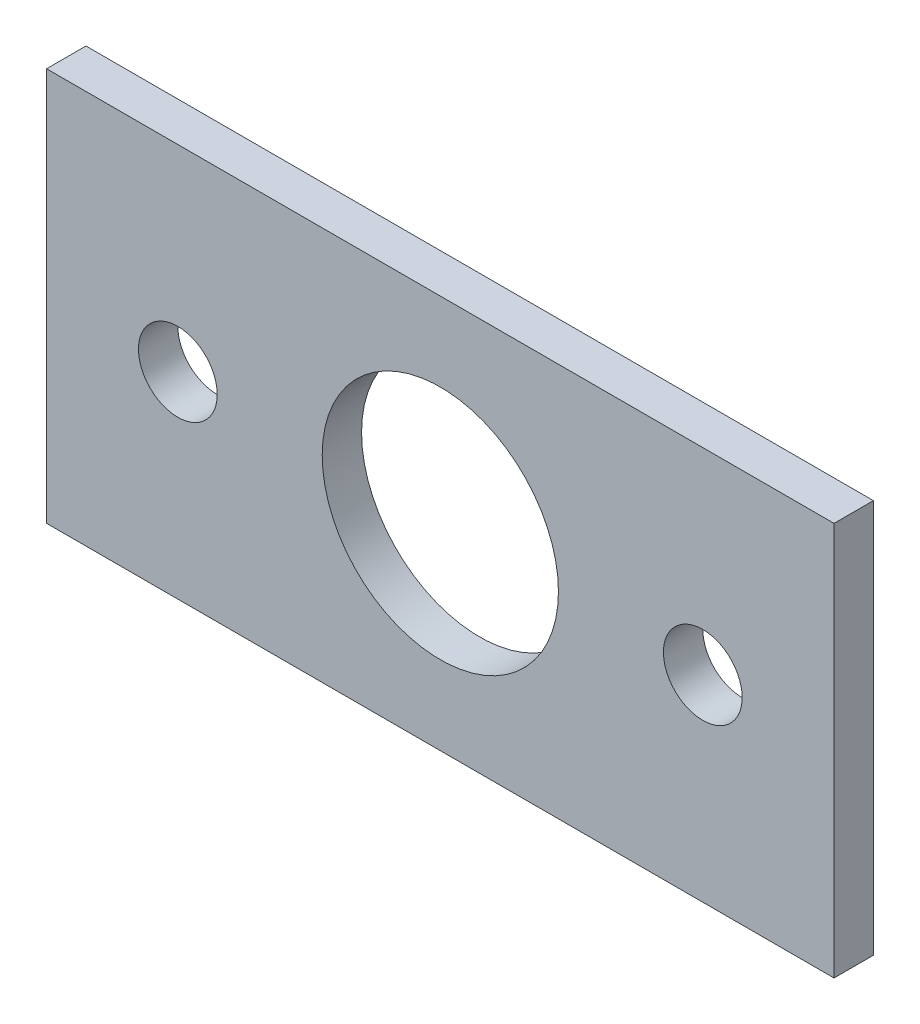
ISO-10303-21;
HEADER;
FILE_DESCRIPTION(('STEP AP214'),'2;1');
FILE_NAME('part.step','',(''),(''),'','','');
FILE_SCHEMA(('AUTOMOTIVE_DESIGN { 1 0 10303 214 1 1 1 1 }'));
ENDSEC;
DATA;
#1=APPLICATION_CONTEXT('core data for automotive mechanical design processes');
#2=APPLICATION_PROTOCOL_DEFINITION('international standard','automotive_design',2000,#1);
#3=PRODUCT_CONTEXT('',#1,'mechanical');
#4=PRODUCT('Part','Part','',(#3));
#5=PRODUCT_RELATED_PRODUCT_CATEGORY('part','',(#4));
#6=PRODUCT_DEFINITION_FORMATION('','',#4);
#7=PRODUCT_DEFINITION_CONTEXT('part definition',#1,'design');
#8=PRODUCT_DEFINITION('design','',#6,#7);
#9=PRODUCT_DEFINITION_SHAPE('','',#8);
#10=(LENGTH_UNIT() NAMED_UNIT(*) SI_UNIT(.MILLI.,.METRE.));
#11=(NAMED_UNIT(*) PLANE_ANGLE_UNIT() SI_UNIT($,.RADIAN.));
#12=(NAMED_UNIT(*) SI_UNIT($,.STERADIAN.) SOLID_ANGLE_UNIT());
#13=UNCERTAINTY_MEASURE_WITH_UNIT(LENGTH_MEASURE(1.E-05),#10,'distance_accuracy_value','');
#14=(GEOMETRIC_REPRESENTATION_CONTEXT(3) GLOBAL_UNCERTAINTY_ASSIGNED_CONTEXT((#13)) GLOBAL_UNIT_ASSIGNED_CONTEXT((#10,
#11,#12)) REPRESENTATION_CONTEXT('',''));
#15=CARTESIAN_POINT('',(0.,0.,0.));
#16=DIRECTION('',(0.,0.,1.));
#17=DIRECTION('',(1.,0.,0.));
#18=AXIS2_PLACEMENT_3D('',#15,#16,#17);
#19=CARTESIAN_POINT('',(-26.8631074324673,-1.81810526315788,1.5));
#20=DIRECTION('',(0.,0.,1.));
#21=DIRECTION('',(1.,0.,0.));
#22=AXIS2_PLACEMENT_3D('',#19,#20,#21);
#23=PLANE('',#22);
#24=CARTESIAN_POINT('',(-21.8631074324673,5.68189473684212,1.5));
#25=DIRECTION('',(0.,0.,1.));
#26=DIRECTION('',(1.,0.,0.));
#27=AXIS2_PLACEMENT_3D('',#24,#25,#26);
#28=CIRCLE('',#27,1.5);
#29=CARTESIAN_POINT('',(-20.3631074324673,5.68189473684212,1.5));
#30=VERTEX_POINT('',#29);
#31=EDGE_CURVE('E113',#30,#30,#28,.T.);
#32=ORIENTED_EDGE('',*,*,#31,.F.);
#33=EDGE_LOOP('',(#32));
#34=FACE_BOUND('',#33,.T.);
#35=DIRECTION('',(0.,-1.,0.));
#36=VECTOR('',#35,1.);
#37=CARTESIAN_POINT('',(-26.8631074324673,13.1818947368421,1.5));
#38=LINE('',#37,#36);
#39=CARTESIAN_POINT('',(-26.8631074324673,13.1818947368421,1.5));
#40=VERTEX_POINT('',#39);
#41=CARTESIAN_POINT('',(-26.8631074324673,-1.81810526315788,1.5));
#42=VERTEX_POINT('',#41);
#43=EDGE_CURVE('E83',#40,#42,#38,.T.);
#44=ORIENTED_EDGE('',*,*,#43,.T.);
#45=DIRECTION('',(1.,0.,0.));
#46=VECTOR('',#45,1.);
#47=CARTESIAN_POINT('',(-26.8631074324673,-1.81810526315788,1.5));
#48=LINE('',#47,#46);
#49=CARTESIAN_POINT('',(3.13689256753267,-1.81810526315788,1.5));
#50=VERTEX_POINT('',#49);
#51=EDGE_CURVE('E78',#42,#50,#48,.T.);
#52=ORIENTED_EDGE('',*,*,#51,.T.);
#53=DIRECTION('',(0.,1.,0.));
#54=VECTOR('',#53,1.);
#55=CARTESIAN_POINT('',(3.13689256753266,13.1818947368421,1.5));
#56=LINE('',#55,#54);
#57=CARTESIAN_POINT('',(3.13689256753266,13.1818947368421,1.5));
#58=VERTEX_POINT('',#57);
#59=EDGE_CURVE('E81',#50,#58,#56,.T.);
#60=ORIENTED_EDGE('',*,*,#59,.T.);
#61=DIRECTION('',(-1.,0.,0.));
#62=VECTOR('',#61,1.);
#63=CARTESIAN_POINT('',(-26.8631074324673,13.1818947368421,1.5));
#64=LINE('',#63,#62);
#65=EDGE_CURVE('E48',#58,#40,#64,.T.);
#66=ORIENTED_EDGE('',*,*,#65,.T.);
#67=EDGE_LOOP('',(#44,#52,#60,#66));
#68=FACE_BOUND('',#67,.T.);
#69=CARTESIAN_POINT('',(-11.8631074324673,5.68189473684212,1.5));
#70=DIRECTION('',(0.,0.,1.));
#71=DIRECTION('',(1.,0.,0.));
#72=AXIS2_PLACEMENT_3D('',#69,#70,#71);
#73=CIRCLE('',#72,4.5);
#74=CARTESIAN_POINT('',(-7.36310743246734,5.68189473684212,1.5));
#75=VERTEX_POINT('',#74);
#76=EDGE_CURVE('E98',#75,#75,#73,.T.);
#77=ORIENTED_EDGE('',*,*,#76,.F.);
#78=EDGE_LOOP('',(#77));
#79=FACE_BOUND('',#78,.T.);
#80=CARTESIAN_POINT('',(-1.86310743246734,5.68189473684212,1.5));
#81=DIRECTION('',(0.,0.,1.));
#82=DIRECTION('',(1.,0.,0.));
#83=AXIS2_PLACEMENT_3D('',#80,#81,#82);
#84=CIRCLE('',#83,1.5);
#85=CARTESIAN_POINT('',(-0.363107432467339,5.68189473684212,1.5));
#86=VERTEX_POINT('',#85);
#87=EDGE_CURVE('E119',#86,#86,#84,.T.);
#88=ORIENTED_EDGE('',*,*,#87,.F.);
#89=EDGE_LOOP('',(#88));
#90=FACE_BOUND('',#89,.T.);
#91=ADVANCED_FACE('F31',(#34,#68,#79,#90),#23,.T.);
#92=CARTESIAN_POINT('',(-26.8631074324673,-1.81810526315788,0.));
#93=DIRECTION('',(0.,0.,1.));
#94=DIRECTION('',(1.,0.,0.));
#95=AXIS2_PLACEMENT_3D('',#92,#93,#94);
#96=PLANE('',#95);
#97=CARTESIAN_POINT('',(-21.8631074324673,5.68189473684212,0.));
#98=DIRECTION('',(0.,0.,1.));
#99=DIRECTION('',(1.,0.,0.));
#100=AXIS2_PLACEMENT_3D('',#97,#98,#99);
#101=CIRCLE('',#100,1.5);
#102=CARTESIAN_POINT('',(-20.3631074324673,5.68189473684212,0.));
#103=VERTEX_POINT('',#102);
#104=EDGE_CURVE('E116',#103,#103,#101,.T.);
#105=ORIENTED_EDGE('',*,*,#104,.T.);
#106=EDGE_LOOP('',(#105));
#107=FACE_BOUND('',#106,.T.);
#108=DIRECTION('',(0.,-1.,0.));
#109=VECTOR('',#108,1.);
#110=CARTESIAN_POINT('',(-26.8631074324673,13.1818947368421,0.));
#111=LINE('',#110,#109);
#112=CARTESIAN_POINT('',(-26.8631074324673,13.1818947368421,0.));
#113=VERTEX_POINT('',#112);
#114=CARTESIAN_POINT('',(-26.8631074324673,-1.81810526315788,0.));
#115=VERTEX_POINT('',#114);
#116=EDGE_CURVE('E95',#113,#115,#111,.T.);
#117=ORIENTED_EDGE('',*,*,#116,.F.);
#118=DIRECTION('',(-1.,0.,0.));
#119=VECTOR('',#118,1.);
#120=CARTESIAN_POINT('',(-26.8631074324673,13.1818947368421,0.));
#121=LINE('',#120,#119);
#122=CARTESIAN_POINT('',(3.13689256753266,13.1818947368421,0.));
#123=VERTEX_POINT('',#122);
#124=EDGE_CURVE('E71',#123,#113,#121,.T.);
#125=ORIENTED_EDGE('',*,*,#124,.F.);
#126=DIRECTION('',(0.,1.,0.));
#127=VECTOR('',#126,1.);
#128=CARTESIAN_POINT('',(3.13689256753266,13.1818947368421,0.));
#129=LINE('',#128,#127);
#130=CARTESIAN_POINT('',(3.13689256753267,-1.81810526315788,0.));
#131=VERTEX_POINT('',#130);
#132=EDGE_CURVE('E65',#131,#123,#129,.T.);
#133=ORIENTED_EDGE('',*,*,#132,.F.);
#134=DIRECTION('',(1.,0.,0.));
#135=VECTOR('',#134,1.);
#136=CARTESIAN_POINT('',(-26.8631074324673,-1.81810526315788,0.));
#137=LINE('',#136,#135);
#138=EDGE_CURVE('E87',#115,#131,#137,.T.);
#139=ORIENTED_EDGE('',*,*,#138,.F.);
#140=EDGE_LOOP('',(#117,#125,#133,#139));
#141=FACE_BOUND('',#140,.T.);
#142=CARTESIAN_POINT('',(-11.8631074324673,5.68189473684212,0.));
#143=DIRECTION('',(0.,0.,1.));
#144=DIRECTION('',(1.,0.,0.));
#145=AXIS2_PLACEMENT_3D('',#142,#143,#144);
#146=CIRCLE('',#145,4.5);
#147=CARTESIAN_POINT('',(-7.36310743246734,5.68189473684212,0.));
#148=VERTEX_POINT('',#147);
#149=EDGE_CURVE('E110',#148,#148,#146,.T.);
#150=ORIENTED_EDGE('',*,*,#149,.T.);
#151=EDGE_LOOP('',(#150));
#152=FACE_BOUND('',#151,.T.);
#153=CARTESIAN_POINT('',(-1.86310743246734,5.68189473684212,0.));
#154=DIRECTION('',(0.,0.,1.));
#155=DIRECTION('',(1.,0.,0.));
#156=AXIS2_PLACEMENT_3D('',#153,#154,#155);
#157=CIRCLE('',#156,1.5);
#158=CARTESIAN_POINT('',(-0.363107432467339,5.68189473684212,0.));
#159=VERTEX_POINT('',#158);
#160=EDGE_CURVE('E122',#159,#159,#157,.T.);
#161=ORIENTED_EDGE('',*,*,#160,.T.);
#162=EDGE_LOOP('',(#161));
#163=FACE_BOUND('',#162,.T.);
#164=ADVANCED_FACE('F106',(#107,#141,#152,#163),#96,.F.);
#165=CARTESIAN_POINT('',(-26.8631074324673,13.1818947368421,1.5));
#166=DIRECTION('',(1.,0.,0.));
#167=DIRECTION('',(0.,0.,-1.));
#168=AXIS2_PLACEMENT_3D('',#165,#166,#167);
#169=PLANE('',#168);
#170=ORIENTED_EDGE('',*,*,#116,.T.);
#171=DIRECTION('',(0.,0.,-1.));
#172=VECTOR('',#171,1.);
#173=CARTESIAN_POINT('',(-26.8631074324673,-1.81810526315788,1.5));
#174=LINE('',#173,#172);
#175=EDGE_CURVE('E11',#42,#115,#174,.T.);
#176=ORIENTED_EDGE('',*,*,#175,.F.);
#177=ORIENTED_EDGE('',*,*,#43,.F.);
#178=DIRECTION('',(0.,0.,-1.));
#179=VECTOR('',#178,1.);
#180=CARTESIAN_POINT('',(-26.8631074324673,13.1818947368421,1.5));
#181=LINE('',#180,#179);
#182=EDGE_CURVE('E91',#40,#113,#181,.T.);
#183=ORIENTED_EDGE('',*,*,#182,.T.);
#184=EDGE_LOOP('',(#170,#176,#177,#183));
#185=FACE_BOUND('',#184,.T.);
#186=ADVANCED_FACE('F33',(#185),#169,.F.);
#187=CARTESIAN_POINT('',(-26.8631074324673,-1.81810526315788,1.5));
#188=DIRECTION('',(0.,1.,0.));
#189=DIRECTION('',(0.,0.,1.));
#190=AXIS2_PLACEMENT_3D('',#187,#188,#189);
#191=PLANE('',#190);
#192=ORIENTED_EDGE('',*,*,#138,.T.);
#193=DIRECTION('',(0.,0.,-1.));
#194=VECTOR('',#193,1.);
#195=CARTESIAN_POINT('',(3.13689256753267,-1.81810526315788,1.5));
#196=LINE('',#195,#194);
#197=EDGE_CURVE('E40',#50,#131,#196,.T.);
#198=ORIENTED_EDGE('',*,*,#197,.F.);
#199=ORIENTED_EDGE('',*,*,#51,.F.);
#200=ORIENTED_EDGE('',*,*,#175,.T.);
#201=EDGE_LOOP('',(#192,#198,#199,#200));
#202=FACE_BOUND('',#201,.T.);
#203=ADVANCED_FACE('F86',(#202),#191,.F.);
#204=CARTESIAN_POINT('',(3.13689256753266,13.1818947368421,1.5));
#205=DIRECTION('',(-1.,0.,0.));
#206=DIRECTION('',(0.,-1.,0.));
#207=AXIS2_PLACEMENT_3D('',#204,#205,#206);
#208=PLANE('',#207);
#209=ORIENTED_EDGE('',*,*,#132,.T.);
#210=DIRECTION('',(0.,0.,-1.));
#211=VECTOR('',#210,1.);
#212=CARTESIAN_POINT('',(3.13689256753266,13.1818947368421,1.5));
#213=LINE('',#212,#211);
#214=EDGE_CURVE('E88',#58,#123,#213,.T.);
#215=ORIENTED_EDGE('',*,*,#214,.F.);
#216=ORIENTED_EDGE('',*,*,#59,.F.);
#217=ORIENTED_EDGE('',*,*,#197,.T.);
#218=EDGE_LOOP('',(#209,#215,#216,#217));
#219=FACE_BOUND('',#218,.T.);
#220=ADVANCED_FACE('F89',(#219),#208,.F.);
#221=CARTESIAN_POINT('',(-26.8631074324673,13.1818947368421,1.5));
#222=DIRECTION('',(0.,-1.,0.));
#223=DIRECTION('',(0.,0.,-1.));
#224=AXIS2_PLACEMENT_3D('',#221,#222,#223);
#225=PLANE('',#224);
#226=ORIENTED_EDGE('',*,*,#124,.T.);
#227=ORIENTED_EDGE('',*,*,#182,.F.);
#228=ORIENTED_EDGE('',*,*,#65,.F.);
#229=ORIENTED_EDGE('',*,*,#214,.T.);
#230=EDGE_LOOP('',(#226,#227,#228,#229));
#231=FACE_BOUND('',#230,.T.);
#232=ADVANCED_FACE('F103',(#231),#225,.F.);
#233=CARTESIAN_POINT('',(-11.8631074324673,5.68189473684212,1.5));
#234=DIRECTION('',(0.,0.,-1.));
#235=DIRECTION('',(-1.,0.,0.));
#236=AXIS2_PLACEMENT_3D('',#233,#234,#235);
#237=CYLINDRICAL_SURFACE('',#236,4.5);
#238=ORIENTED_EDGE('',*,*,#76,.T.);
#239=EDGE_LOOP('',(#238));
#240=FACE_BOUND('',#239,.T.);
#241=ORIENTED_EDGE('',*,*,#149,.F.);
#242=EDGE_LOOP('',(#241));
#243=FACE_BOUND('',#242,.T.);
#244=ADVANCED_FACE('F141',(#240,#243),#237,.F.);
#245=CARTESIAN_POINT('',(-21.8631074324673,5.68189473684212,1.5));
#246=DIRECTION('',(0.,0.,-1.));
#247=DIRECTION('',(-1.,0.,0.));
#248=AXIS2_PLACEMENT_3D('',#245,#246,#247);
#249=CYLINDRICAL_SURFACE('',#248,1.5);
#250=ORIENTED_EDGE('',*,*,#31,.T.);
#251=EDGE_LOOP('',(#250));
#252=FACE_BOUND('',#251,.T.);
#253=ORIENTED_EDGE('',*,*,#104,.F.);
#254=EDGE_LOOP('',(#253));
#255=FACE_BOUND('',#254,.T.);
#256=ADVANCED_FACE('F187',(#252,#255),#249,.F.);
#257=CARTESIAN_POINT('',(-1.86310743246734,5.68189473684212,1.5));
#258=DIRECTION('',(0.,0.,-1.));
#259=DIRECTION('',(-1.,0.,0.));
#260=AXIS2_PLACEMENT_3D('',#257,#258,#259);
#261=CYLINDRICAL_SURFACE('',#260,1.5);
#262=ORIENTED_EDGE('',*,*,#87,.T.);
#263=EDGE_LOOP('',(#262));
#264=FACE_BOUND('',#263,.T.);
#265=ORIENTED_EDGE('',*,*,#160,.F.);
#266=EDGE_LOOP('',(#265));
#267=FACE_BOUND('',#266,.T.);
#268=ADVANCED_FACE('F128',(#264,#267),#261,.F.);
#269=CLOSED_SHELL('',(#91,#164,#186,#203,#220,#232,#244,#256,#268));
#270=MANIFOLD_SOLID_BREP('B2',#269);
#271=ADVANCED_BREP_SHAPE_REPRESENTATION('',(#18,#270),#14);
#272=SHAPE_DEFINITION_REPRESENTATION(#9,#271);
ENDSEC;
END-ISO-10303-21;
